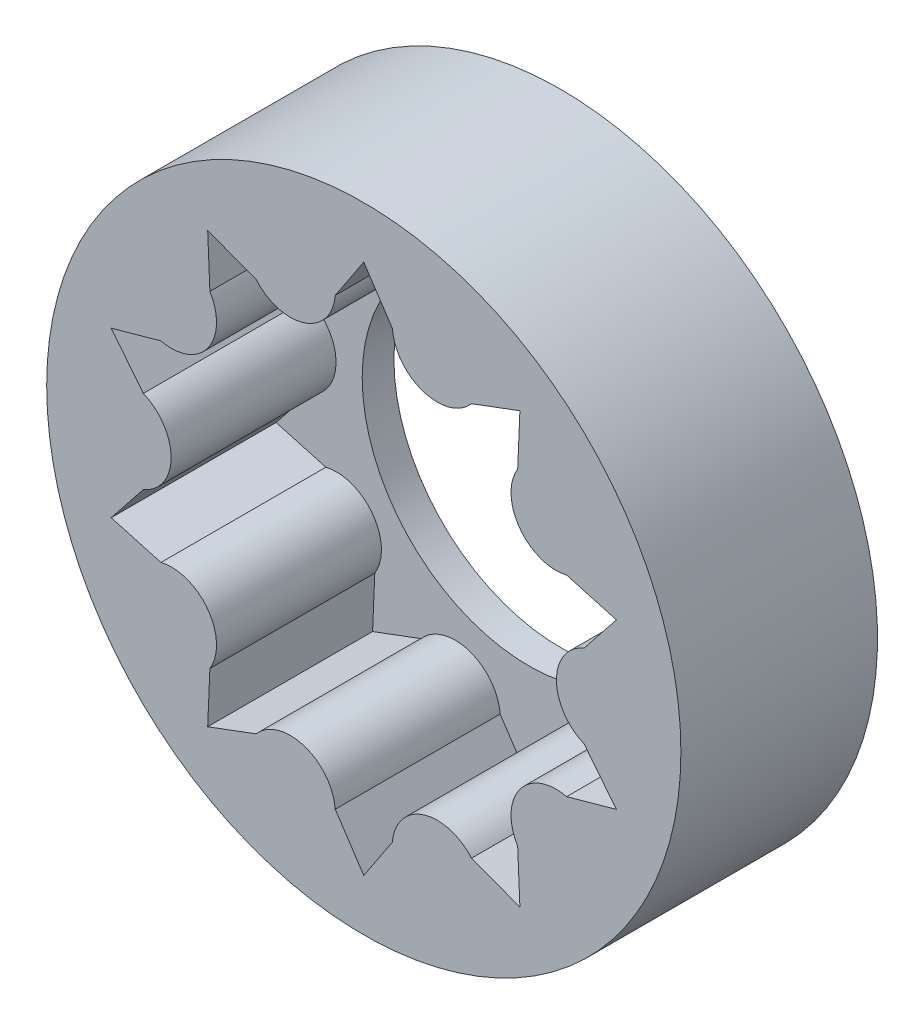
ISO-10303-21;
HEADER;
FILE_DESCRIPTION(('STEP AP214'),'2;1');
FILE_NAME('part.step','',(''),(''),'','','');
FILE_SCHEMA(('AUTOMOTIVE_DESIGN { 1 0 10303 214 1 1 1 1 }'));
ENDSEC;
DATA;
#1=APPLICATION_CONTEXT('core data for automotive mechanical design processes');
#2=APPLICATION_PROTOCOL_DEFINITION('international standard','automotive_design',2000,#1);
#3=PRODUCT_CONTEXT('',#1,'mechanical');
#4=PRODUCT('Part','Part','',(#3));
#5=PRODUCT_RELATED_PRODUCT_CATEGORY('part','',(#4));
#6=PRODUCT_DEFINITION_FORMATION('','',#4);
#7=PRODUCT_DEFINITION_CONTEXT('part definition',#1,'design');
#8=PRODUCT_DEFINITION('design','',#6,#7);
#9=PRODUCT_DEFINITION_SHAPE('','',#8);
#10=(LENGTH_UNIT() NAMED_UNIT(*) SI_UNIT(.MILLI.,.METRE.));
#11=(NAMED_UNIT(*) PLANE_ANGLE_UNIT() SI_UNIT($,.RADIAN.));
#12=(NAMED_UNIT(*) SI_UNIT($,.STERADIAN.) SOLID_ANGLE_UNIT());
#13=UNCERTAINTY_MEASURE_WITH_UNIT(LENGTH_MEASURE(1.E-05),#10,'distance_accuracy_value','');
#14=(GEOMETRIC_REPRESENTATION_CONTEXT(3) GLOBAL_UNCERTAINTY_ASSIGNED_CONTEXT((#13)) GLOBAL_UNIT_ASSIGNED_CONTEXT((#10,
#11,#12)) REPRESENTATION_CONTEXT('',''));
#15=CARTESIAN_POINT('',(0.,0.,0.));
#16=DIRECTION('',(0.,0.,1.));
#17=DIRECTION('',(1.,0.,0.));
#18=AXIS2_PLACEMENT_3D('',#15,#16,#17);
#19=CARTESIAN_POINT('',(7.7145187522875,5.11511880268551,10.4));
#20=DIRECTION('',(0.833438523812044,0.552612185014048,0.));
#21=DIRECTION('',(-0.552612185014048,0.833438523812044,0.));
#22=AXIS2_PLACEMENT_3D('',#19,#20,#21);
#23=PLANE('',#22);
#24=DIRECTION('',(0.552612185014048,-0.833438523812044,0.));
#25=VECTOR('',#24,1.);
#26=CARTESIAN_POINT('',(7.7145187522875,5.11511880268551,0.));
#27=LINE('',#26,#25);
#28=CARTESIAN_POINT('',(0.,16.75,0.));
#29=VERTEX_POINT('',#28);
#30=CARTESIAN_POINT('',(1.80016738124717,14.0350239543612,0.));
#31=VERTEX_POINT('',#30);
#32=EDGE_CURVE('E543',#29,#31,#27,.T.);
#33=ORIENTED_EDGE('',*,*,#32,.T.);
#34=DIRECTION('',(0.,0.,-1.));
#35=VECTOR('',#34,1.);
#36=CARTESIAN_POINT('',(1.80016738124717,14.0350239543612,10.4));
#37=LINE('',#36,#35);
#38=CARTESIAN_POINT('',(1.80016738124717,14.0350239543612,10.4));
#39=VERTEX_POINT('',#38);
#40=EDGE_CURVE('E11',#39,#31,#37,.T.);
#41=ORIENTED_EDGE('',*,*,#40,.F.);
#42=DIRECTION('',(0.552612185014048,-0.833438523812044,0.));
#43=VECTOR('',#42,1.);
#44=CARTESIAN_POINT('',(7.7145187522875,5.11511880268551,10.4));
#45=LINE('',#44,#43);
#46=CARTESIAN_POINT('',(0.,16.75,10.4));
#47=VERTEX_POINT('',#46);
#48=EDGE_CURVE('E544',#47,#39,#45,.T.);
#49=ORIENTED_EDGE('',*,*,#48,.F.);
#50=DIRECTION('',(0.,0.,-1.));
#51=VECTOR('',#50,1.);
#52=CARTESIAN_POINT('',(0.,16.75,10.4));
#53=LINE('',#52,#51);
#54=EDGE_CURVE('E556',#47,#29,#53,.T.);
#55=ORIENTED_EDGE('',*,*,#54,.T.);
#56=EDGE_LOOP('',(#33,#41,#49,#55));
#57=FACE_BOUND('',#56,.T.);
#58=ADVANCED_FACE('F41',(#57),#23,.F.);
#59=CARTESIAN_POINT('',(4.63248079498068,14.2573098789925,10.4));
#60=DIRECTION('',(0.,0.,-1.));
#61=DIRECTION('',(-1.,0.,0.));
#62=AXIS2_PLACEMENT_3D('',#59,#60,#61);
#63=CYLINDRICAL_SURFACE('',#62,2.84102275701973);
#64=CARTESIAN_POINT('',(4.63248079498068,14.2573098789925,0.));
#65=DIRECTION('',(0.,0.,1.));
#66=DIRECTION('',(1.,0.,0.));
#67=AXIS2_PLACEMENT_3D('',#64,#65,#66);
#68=CIRCLE('',#67,2.84102275701973);
#69=CARTESIAN_POINT('',(6.79321409179673,12.4126847338928,0.));
#70=VERTEX_POINT('',#69);
#71=EDGE_CURVE('E560',#31,#70,#68,.T.);
#72=ORIENTED_EDGE('',*,*,#71,.T.);
#73=DIRECTION('',(0.,0.,-1.));
#74=VECTOR('',#73,1.);
#75=CARTESIAN_POINT('',(6.79321409179673,12.4126847338928,10.4));
#76=LINE('',#75,#74);
#77=CARTESIAN_POINT('',(6.79321409179673,12.4126847338928,10.4));
#78=VERTEX_POINT('',#77);
#79=EDGE_CURVE('E49',#78,#70,#76,.T.);
#80=ORIENTED_EDGE('',*,*,#79,.F.);
#81=CARTESIAN_POINT('',(4.63248079498068,14.2573098789925,10.4));
#82=DIRECTION('',(0.,0.,1.));
#83=DIRECTION('',(1.,0.,0.));
#84=AXIS2_PLACEMENT_3D('',#81,#82,#83);
#85=CIRCLE('',#84,2.84102275701973);
#86=EDGE_CURVE('E61',#39,#78,#85,.T.);
#87=ORIENTED_EDGE('',*,*,#86,.F.);
#88=ORIENTED_EDGE('',*,*,#40,.T.);
#89=EDGE_LOOP('',(#72,#80,#87,#88));
#90=FACE_BOUND('',#89,.T.);
#91=ADVANCED_FACE('F578',(#90),#63,.T.);
#92=CARTESIAN_POINT('',(-3.23458537808231,8.67269839074775,10.4));
#93=DIRECTION('',(-0.349448636942334,0.936955521964167,0.));
#94=DIRECTION('',(-0.936955521964167,-0.349448636942334,0.));
#95=AXIS2_PLACEMENT_3D('',#92,#93,#94);
#96=PLANE('',#95);
#97=DIRECTION('',(0.936955521964167,0.349448636942334,0.));
#98=VECTOR('',#97,1.);
#99=CARTESIAN_POINT('',(-3.23458537808231,8.67269839074775,0.));
#100=LINE('',#99,#98);
#101=CARTESIAN_POINT('',(9.84540297589875,13.5510346557805,0.));
#102=VERTEX_POINT('',#101);
#103=EDGE_CURVE('E547',#70,#102,#100,.T.);
#104=ORIENTED_EDGE('',*,*,#103,.T.);
#105=DIRECTION('',(0.,0.,-1.));
#106=VECTOR('',#105,1.);
#107=CARTESIAN_POINT('',(9.84540297589894,13.5510346557804,10.4));
#108=LINE('',#107,#106);
#109=CARTESIAN_POINT('',(9.84540297589894,13.5510346557804,10.4));
#110=VERTEX_POINT('',#109);
#111=EDGE_CURVE('E570',#110,#102,#108,.T.);
#112=ORIENTED_EDGE('',*,*,#111,.F.);
#113=DIRECTION('',(0.936955521964167,0.349448636942334,0.));
#114=VECTOR('',#113,1.);
#115=CARTESIAN_POINT('',(-3.23458537808231,8.67269839074775,10.4));
#116=LINE('',#115,#114);
#117=EDGE_CURVE('E56',#78,#110,#116,.T.);
#118=ORIENTED_EDGE('',*,*,#117,.F.);
#119=ORIENTED_EDGE('',*,*,#79,.T.);
#120=EDGE_LOOP('',(#104,#112,#118,#119));
#121=FACE_BOUND('',#120,.T.);
#122=ADVANCED_FACE('F576',(#121),#96,.F.);
#123=CARTESIAN_POINT('',(0.,0.,10.4));
#124=DIRECTION('',(0.,0.,-1.));
#125=DIRECTION('',(-1.,0.,0.));
#126=AXIS2_PLACEMENT_3D('',#123,#124,#125);
#127=CYLINDRICAL_SURFACE('',#126,20.);
#128=CARTESIAN_POINT('',(0.,0.,10.4));
#129=DIRECTION('',(0.,0.,1.));
#130=DIRECTION('',(1.,0.,0.));
#131=AXIS2_PLACEMENT_3D('',#128,#129,#130);
#132=CIRCLE('',#131,20.);
#133=CARTESIAN_POINT('',(20.,0.,10.4));
#134=VERTEX_POINT('',#133);
#135=EDGE_CURVE('E552',#134,#134,#132,.T.);
#136=ORIENTED_EDGE('',*,*,#135,.F.);
#137=EDGE_LOOP('',(#136));
#138=FACE_BOUND('',#137,.T.);
#139=CARTESIAN_POINT('',(0.,0.,-2.));
#140=DIRECTION('',(0.,0.,-1.));
#141=DIRECTION('',(-1.,0.,0.));
#142=AXIS2_PLACEMENT_3D('',#139,#140,#141);
#143=CIRCLE('',#142,20.);
#144=CARTESIAN_POINT('',(-20.,0.,-2.));
#145=VERTEX_POINT('',#144);
#146=EDGE_CURVE('E582',#145,#145,#143,.T.);
#147=ORIENTED_EDGE('',*,*,#146,.F.);
#148=EDGE_LOOP('',(#147));
#149=FACE_BOUND('',#148,.T.);
#150=ADVANCED_FACE('F682',(#138,#149),#127,.T.);
#151=CARTESIAN_POINT('',(0.,0.,10.4));
#152=DIRECTION('',(0.,0.,1.));
#153=DIRECTION('',(1.,0.,0.));
#154=AXIS2_PLACEMENT_3D('',#151,#152,#153);
#155=PLANE('',#154);
#156=ORIENTED_EDGE('',*,*,#135,.T.);
#157=EDGE_LOOP('',(#156));
#158=FACE_BOUND('',#157,.T.);
#159=ORIENTED_EDGE('',*,*,#48,.T.);
#160=ORIENTED_EDGE('',*,*,#86,.T.);
#161=ORIENTED_EDGE('',*,*,#117,.T.);
#162=DIRECTION('',(-0.0428102240140782,-0.999083222119091,0.));
#163=VECTOR('',#162,1.);
#164=CARTESIAN_POINT('',(9.24776816996728,-0.39626231150879,10.4));
#165=LINE('',#164,#163);
#166=CARTESIAN_POINT('',(9.7059461000934,10.2964610571828,10.4));
#167=VERTEX_POINT('',#166);
#168=EDGE_CURVE('E249',#110,#167,#165,.T.);
#169=ORIENTED_EDGE('',*,*,#168,.T.);
#170=CARTESIAN_POINT('',(12.1279921734904,8.8115020933572,10.4));
#171=DIRECTION('',(0.,0.,1.));
#172=DIRECTION('',(0.809016994374955,-0.587785252292462,0.));
#173=AXIS2_PLACEMENT_3D('',#170,#171,#172);
#174=CIRCLE('',#173,2.84102275701973);
#175=CARTESIAN_POINT('',(12.7918186746289,6.04912183671436,10.4));
#176=VERTEX_POINT('',#175);
#177=EDGE_CURVE('E270',#167,#176,#174,.T.);
#178=ORIENTED_EDGE('',*,*,#177,.T.);
#179=DIRECTION('',(0.963413695470875,-0.268018751917012,0.));
#180=VECTOR('',#179,1.);
#181=CARTESIAN_POINT('',(2.48084967103677,8.91760196772087,10.4));
#182=LINE('',#181,#180);
#183=CARTESIAN_POINT('',(15.9301966479438,5.17603465578055,10.4));
#184=VERTEX_POINT('',#183);
#185=EDGE_CURVE('E264',#176,#184,#182,.T.);
#186=ORIENTED_EDGE('',*,*,#185,.T.);
#187=DIRECTION('',(-0.621880582534836,-0.783112087166411,0.));
#188=VECTOR('',#187,1.);
#189=CARTESIAN_POINT('',(7.24868446679903,-5.75628469116745,10.4));
#190=LINE('',#189,#188);
#191=CARTESIAN_POINT('',(13.9043833016786,2.62500000000015,10.4));
#192=VERTEX_POINT('',#191);
#193=EDGE_CURVE('E273',#184,#192,#190,.T.);
#194=ORIENTED_EDGE('',*,*,#193,.T.);
#195=CARTESIAN_POINT('',(14.9910227570197,1.62196645003831E-13,10.4));
#196=DIRECTION('',(0.,0.,1.));
#197=DIRECTION('',(0.309016994374958,-0.95105651629515,0.));
#198=AXIS2_PLACEMENT_3D('',#195,#196,#197);
#199=CIRCLE('',#198,2.84102275701973);
#200=CARTESIAN_POINT('',(13.9043833016787,-2.62499999999985,10.4));
#201=VERTEX_POINT('',#200);
#202=EDGE_CURVE('E277',#192,#201,#199,.T.);
#203=ORIENTED_EDGE('',*,*,#202,.T.);
#204=DIRECTION('',(0.621880582534852,-0.783112087166399,0.));
#205=VECTOR('',#204,1.);
#206=CARTESIAN_POINT('',(7.24868446679892,5.7562846911676,10.4));
#207=LINE('',#206,#205);
#208=CARTESIAN_POINT('',(15.9301966479439,-5.17603465578022,10.4));
#209=VERTEX_POINT('',#208);
#210=EDGE_CURVE('E281',#201,#209,#207,.T.);
#211=ORIENTED_EDGE('',*,*,#210,.T.);
#212=DIRECTION('',(-0.963413695470869,-0.268018751917032,0.));
#213=VECTOR('',#212,1.);
#214=CARTESIAN_POINT('',(2.48084967103695,-8.91760196772081,10.4));
#215=LINE('',#214,#213);
#216=CARTESIAN_POINT('',(12.7918186746291,-6.04912183671408,10.4));
#217=VERTEX_POINT('',#216);
#218=EDGE_CURVE('E306',#209,#217,#215,.T.);
#219=ORIENTED_EDGE('',*,*,#218,.T.);
#220=CARTESIAN_POINT('',(12.1279921734906,-8.81150209335694,10.4));
#221=DIRECTION('',(0.,0.,1.));
#222=DIRECTION('',(-0.309016994374938,-0.951056516295157,0.));
#223=AXIS2_PLACEMENT_3D('',#220,#221,#222);
#224=CIRCLE('',#223,2.84102275701973);
#225=CARTESIAN_POINT('',(9.70594610009362,-10.2964610571826,10.4));
#226=VERTEX_POINT('',#225);
#227=EDGE_CURVE('E310',#217,#226,#224,.T.);
#228=ORIENTED_EDGE('',*,*,#227,.T.);
#229=DIRECTION('',(0.042810224014099,-0.99908322211909,0.));
#230=VECTOR('',#229,1.);
#231=CARTESIAN_POINT('',(9.24776816996728,0.396262311508983,10.4));
#232=LINE('',#231,#230);
#233=CARTESIAN_POINT('',(9.84540297589904,-13.5510346557803,10.4));
#234=VERTEX_POINT('',#233);
#235=EDGE_CURVE('E314',#226,#234,#232,.T.);
#236=ORIENTED_EDGE('',*,*,#235,.T.);
#237=DIRECTION('',(-0.936955521964169,0.349448636942328,0.));
#238=VECTOR('',#237,1.);
#239=CARTESIAN_POINT('',(-3.23458537808225,-8.67269839074776,10.4));
#240=LINE('',#239,#238);
#241=CARTESIAN_POINT('',(6.79321409179682,-12.4126847338927,10.4));
#242=VERTEX_POINT('',#241);
#243=EDGE_CURVE('E340',#234,#242,#240,.T.);
#244=ORIENTED_EDGE('',*,*,#243,.T.);
#245=CARTESIAN_POINT('',(4.63248079498079,-14.2573098789925,10.4));
#246=DIRECTION('',(0.,0.,1.));
#247=DIRECTION('',(-0.809016994374942,-0.58778525229248,0.));
#248=AXIS2_PLACEMENT_3D('',#245,#246,#247);
#249=CIRCLE('',#248,2.84102275701973);
#250=CARTESIAN_POINT('',(1.80016738124728,-14.0350239543612,10.4));
#251=VERTEX_POINT('',#250);
#252=EDGE_CURVE('E344',#242,#251,#249,.T.);
#253=ORIENTED_EDGE('',*,*,#252,.T.);
#254=DIRECTION('',(-0.552612185014042,-0.833438523812048,0.));
#255=VECTOR('',#254,1.);
#256=CARTESIAN_POINT('',(7.71451875228754,-5.11511880268546,10.4));
#257=LINE('',#256,#255);
#258=CARTESIAN_POINT('',(1.26634813746307E-13,-16.75,10.4));
#259=VERTEX_POINT('',#258);
#260=EDGE_CURVE('E348',#251,#259,#257,.T.);
#261=ORIENTED_EDGE('',*,*,#260,.T.);
#262=DIRECTION('',(-0.552612185014048,0.833438523812044,0.));
#263=VECTOR('',#262,1.);
#264=CARTESIAN_POINT('',(-7.7145187522875,-5.11511880268551,10.4));
#265=LINE('',#264,#263);
#266=CARTESIAN_POINT('',(-1.80016738124717,-14.0350239543612,10.4));
#267=VERTEX_POINT('',#266);
#268=EDGE_CURVE('E374',#259,#267,#265,.T.);
#269=ORIENTED_EDGE('',*,*,#268,.T.);
#270=CARTESIAN_POINT('',(-4.63248079498068,-14.2573098789925,10.4));
#271=DIRECTION('',(0.,0.,1.));
#272=DIRECTION('',(-1.,0.,0.));
#273=AXIS2_PLACEMENT_3D('',#270,#271,#272);
#274=CIRCLE('',#273,2.84102275701973);
#275=CARTESIAN_POINT('',(-6.79321409179673,-12.4126847338928,10.4));
#276=VERTEX_POINT('',#275);
#277=EDGE_CURVE('E378',#267,#276,#274,.T.);
#278=ORIENTED_EDGE('',*,*,#277,.T.);
#279=DIRECTION('',(-0.936955521964167,-0.349448636942334,0.));
#280=VECTOR('',#279,1.);
#281=CARTESIAN_POINT('',(3.23458537808231,-8.67269839074775,10.4));
#282=LINE('',#281,#280);
#283=CARTESIAN_POINT('',(-9.84540297589894,-13.5510346557804,10.4));
#284=VERTEX_POINT('',#283);
#285=EDGE_CURVE('E382',#276,#284,#282,.T.);
#286=ORIENTED_EDGE('',*,*,#285,.T.);
#287=DIRECTION('',(0.0428102240140856,0.999083222119091,0.));
#288=VECTOR('',#287,1.);
#289=CARTESIAN_POINT('',(-9.24776816996728,0.396262311508859,10.4));
#290=LINE('',#289,#288);
#291=CARTESIAN_POINT('',(-9.70594610009348,-10.2964610571827,10.4));
#292=VERTEX_POINT('',#291);
#293=EDGE_CURVE('E408',#284,#292,#290,.T.);
#294=ORIENTED_EDGE('',*,*,#293,.T.);
#295=CARTESIAN_POINT('',(-12.1279921734905,-8.81150209335711,10.4));
#296=DIRECTION('',(0.,0.,1.));
#297=DIRECTION('',(-0.809016994374951,0.587785252292469,0.));
#298=AXIS2_PLACEMENT_3D('',#295,#296,#297);
#299=CIRCLE('',#298,2.84102275701973);
#300=CARTESIAN_POINT('',(-12.791818674629,-6.04912183671426,10.4));
#301=VERTEX_POINT('',#300);
#302=EDGE_CURVE('E412',#292,#301,#299,.T.);
#303=ORIENTED_EDGE('',*,*,#302,.T.);
#304=DIRECTION('',(-0.963413695470873,0.268018751917019,0.));
#305=VECTOR('',#304,1.);
#306=CARTESIAN_POINT('',(-2.48084967103683,-8.91760196772086,10.4));
#307=LINE('',#306,#305);
#308=CARTESIAN_POINT('',(-15.9301966479438,-5.17603465578044,10.4));
#309=VERTEX_POINT('',#308);
#310=EDGE_CURVE('E416',#301,#309,#307,.T.);
#311=ORIENTED_EDGE('',*,*,#310,.T.);
#312=DIRECTION('',(0.621880582534841,0.783112087166407,0.));
#313=VECTOR('',#312,1.);
#314=CARTESIAN_POINT('',(-7.24868446679899,5.7562846911675,10.4));
#315=LINE('',#314,#313);
#316=CARTESIAN_POINT('',(-13.9043833016786,-2.62500000000005,10.4));
#317=VERTEX_POINT('',#316);
#318=EDGE_CURVE('E442',#309,#317,#315,.T.);
#319=ORIENTED_EDGE('',*,*,#318,.T.);
#320=CARTESIAN_POINT('',(-14.9910227570197,0.,10.4));
#321=DIRECTION('',(0.,0.,1.));
#322=DIRECTION('',(-0.309016994374952,0.951056516295152,0.));
#323=AXIS2_PLACEMENT_3D('',#320,#321,#322);
#324=CIRCLE('',#323,2.84102275701973);
#325=CARTESIAN_POINT('',(-13.9043833016787,2.62499999999995,10.4));
#326=VERTEX_POINT('',#325);
#327=EDGE_CURVE('E446',#317,#326,#324,.T.);
#328=ORIENTED_EDGE('',*,*,#327,.T.);
#329=DIRECTION('',(-0.621880582534847,0.783112087166403,0.));
#330=VECTOR('',#329,1.);
#331=CARTESIAN_POINT('',(-7.24868446679896,-5.75628469116755,10.4));
#332=LINE('',#331,#330);
#333=CARTESIAN_POINT('',(-15.9301966479438,5.17603465578032,10.4));
#334=VERTEX_POINT('',#333);
#335=EDGE_CURVE('E450',#326,#334,#332,.T.);
#336=ORIENTED_EDGE('',*,*,#335,.T.);
#337=DIRECTION('',(0.963413695470871,0.268018751917025,0.));
#338=VECTOR('',#337,1.);
#339=CARTESIAN_POINT('',(-2.48084967103689,8.91760196772083,10.4));
#340=LINE('',#339,#338);
#341=CARTESIAN_POINT('',(-12.791818674629,6.04912183671417,10.4));
#342=VERTEX_POINT('',#341);
#343=EDGE_CURVE('E476',#334,#342,#340,.T.);
#344=ORIENTED_EDGE('',*,*,#343,.T.);
#345=CARTESIAN_POINT('',(-12.1279921734906,8.81150209335702,10.4));
#346=DIRECTION('',(0.,0.,1.));
#347=DIRECTION('',(0.309016994374945,0.951056516295155,0.));
#348=AXIS2_PLACEMENT_3D('',#345,#346,#347);
#349=CIRCLE('',#348,2.84102275701973);
#350=CARTESIAN_POINT('',(-9.70594610009355,10.2964610571827,10.4));
#351=VERTEX_POINT('',#350);
#352=EDGE_CURVE('E480',#342,#351,#349,.T.);
#353=ORIENTED_EDGE('',*,*,#352,.T.);
#354=DIRECTION('',(-0.0428102240140923,0.999083222119091,0.));
#355=VECTOR('',#354,1.);
#356=CARTESIAN_POINT('',(-9.24776816996729,-0.396262311508921,10.4));
#357=LINE('',#356,#355);
#358=CARTESIAN_POINT('',(-9.84540297589895,13.5510346557804,10.4));
#359=VERTEX_POINT('',#358);
#360=EDGE_CURVE('E484',#351,#359,#357,.T.);
#361=ORIENTED_EDGE('',*,*,#360,.T.);
#362=DIRECTION('',(0.936955521964167,-0.349448636942335,0.));
#363=VECTOR('',#362,1.);
#364=CARTESIAN_POINT('',(3.23458537808231,8.67269839074774,10.4));
#365=LINE('',#364,#363);
#366=CARTESIAN_POINT('',(-6.79321409179673,12.4126847338928,10.4));
#367=VERTEX_POINT('',#366);
#368=EDGE_CURVE('E510',#359,#367,#365,.T.);
#369=ORIENTED_EDGE('',*,*,#368,.T.);
#370=CARTESIAN_POINT('',(-4.63248079498069,14.2573098789926,10.4));
#371=DIRECTION('',(0.,0.,1.));
#372=DIRECTION('',(0.809016994374947,0.587785252292474,0.));
#373=AXIS2_PLACEMENT_3D('',#370,#371,#372);
#374=CIRCLE('',#373,2.84102275701973);
#375=CARTESIAN_POINT('',(-1.80016738124718,14.0350239543612,10.4));
#376=VERTEX_POINT('',#375);
#377=EDGE_CURVE('E514',#367,#376,#374,.T.);
#378=ORIENTED_EDGE('',*,*,#377,.T.);
#379=DIRECTION('',(0.552612185014049,0.833438523812044,0.));
#380=VECTOR('',#379,1.);
#381=CARTESIAN_POINT('',(-7.7145187522875,5.11511880268552,10.4));
#382=LINE('',#381,#380);
#383=EDGE_CURVE('E518',#376,#47,#382,.T.);
#384=ORIENTED_EDGE('',*,*,#383,.T.);
#385=EDGE_LOOP('',(#159,#160,#161,#169,#178,#186,#194,#203,#211,#219,#228,#236,#244,#253,#261,
#269,#278,#286,#294,#303,#311,#319,#328,#336,#344,#353,#361,#369,#378,#384));
#386=FACE_BOUND('',#385,.T.);
#387=ADVANCED_FACE('F648',(#158,#386),#155,.T.);
#388=CARTESIAN_POINT('',(3.23458537808231,8.67269839074774,10.4));
#389=DIRECTION('',(0.349448636942335,0.936955521964167,0.));
#390=DIRECTION('',(-0.936955521964167,0.349448636942335,0.));
#391=AXIS2_PLACEMENT_3D('',#388,#389,#390);
#392=PLANE('',#391);
#393=DIRECTION('',(0.936955521964167,-0.349448636942335,0.));
#394=VECTOR('',#393,1.);
#395=CARTESIAN_POINT('',(3.23458537808231,8.67269839074774,0.));
#396=LINE('',#395,#394);
#397=CARTESIAN_POINT('',(-9.84540297589894,13.5510346557804,0.));
#398=VERTEX_POINT('',#397);
#399=CARTESIAN_POINT('',(-6.79321409179673,12.4126847338928,0.));
#400=VERTEX_POINT('',#399);
#401=EDGE_CURVE('E509',#398,#400,#396,.T.);
#402=ORIENTED_EDGE('',*,*,#401,.T.);
#403=DIRECTION('',(0.,0.,-1.));
#404=VECTOR('',#403,1.);
#405=CARTESIAN_POINT('',(-6.79321409179673,12.4126847338928,10.4));
#406=LINE('',#405,#404);
#407=EDGE_CURVE('E539',#367,#400,#406,.T.);
#408=ORIENTED_EDGE('',*,*,#407,.F.);
#409=ORIENTED_EDGE('',*,*,#368,.F.);
#410=DIRECTION('',(0.,0.,-1.));
#411=VECTOR('',#410,1.);
#412=CARTESIAN_POINT('',(-9.84540297589895,13.5510346557804,10.4));
#413=LINE('',#412,#411);
#414=EDGE_CURVE('E521',#359,#398,#413,.T.);
#415=ORIENTED_EDGE('',*,*,#414,.T.);
#416=EDGE_LOOP('',(#402,#408,#409,#415));
#417=FACE_BOUND('',#416,.T.);
#418=ADVANCED_FACE('F631',(#417),#392,.F.);
#419=CARTESIAN_POINT('',(-4.63248079498069,14.2573098789926,10.4));
#420=DIRECTION('',(0.,0.,-1.));
#421=DIRECTION('',(-1.,0.,0.));
#422=AXIS2_PLACEMENT_3D('',#419,#420,#421);
#423=CYLINDRICAL_SURFACE('',#422,2.84102275701973);
#424=CARTESIAN_POINT('',(-4.63248079498069,14.2573098789926,0.));
#425=DIRECTION('',(0.,0.,1.));
#426=DIRECTION('',(0.809016994374947,0.587785252292474,0.));
#427=AXIS2_PLACEMENT_3D('',#424,#425,#426);
#428=CIRCLE('',#427,2.84102275701973);
#429=CARTESIAN_POINT('',(-1.80016738124718,14.0350239543612,0.));
#430=VERTEX_POINT('',#429);
#431=EDGE_CURVE('E525',#400,#430,#428,.T.);
#432=ORIENTED_EDGE('',*,*,#431,.T.);
#433=DIRECTION('',(0.,0.,-1.));
#434=VECTOR('',#433,1.);
#435=CARTESIAN_POINT('',(-1.80016738124718,14.0350239543612,10.4));
#436=LINE('',#435,#434);
#437=EDGE_CURVE('E535',#376,#430,#436,.T.);
#438=ORIENTED_EDGE('',*,*,#437,.F.);
#439=ORIENTED_EDGE('',*,*,#377,.F.);
#440=ORIENTED_EDGE('',*,*,#407,.T.);
#441=EDGE_LOOP('',(#432,#438,#439,#440));
#442=FACE_BOUND('',#441,.T.);
#443=ADVANCED_FACE('F627',(#442),#423,.T.);
#444=CARTESIAN_POINT('',(-7.7145187522875,5.11511880268552,10.4));
#445=DIRECTION('',(-0.833438523812044,0.552612185014048,0.));
#446=DIRECTION('',(-0.552612185014049,-0.833438523812044,0.));
#447=AXIS2_PLACEMENT_3D('',#444,#445,#446);
#448=PLANE('',#447);
#449=DIRECTION('',(0.552612185014049,0.833438523812044,0.));
#450=VECTOR('',#449,1.);
#451=CARTESIAN_POINT('',(-7.7145187522875,5.11511880268552,0.));
#452=LINE('',#451,#450);
#453=EDGE_CURVE('E515',#430,#29,#452,.T.);
#454=ORIENTED_EDGE('',*,*,#453,.T.);
#455=ORIENTED_EDGE('',*,*,#54,.F.);
#456=ORIENTED_EDGE('',*,*,#383,.F.);
#457=ORIENTED_EDGE('',*,*,#437,.T.);
#458=EDGE_LOOP('',(#454,#455,#456,#457));
#459=FACE_BOUND('',#458,.T.);
#460=ADVANCED_FACE('F624',(#459),#448,.F.);
#461=CARTESIAN_POINT('',(-2.48084967103689,8.91760196772083,10.4));
#462=DIRECTION('',(-0.268018751917025,0.963413695470871,0.));
#463=DIRECTION('',(-0.963413695470871,-0.268018751917025,0.));
#464=AXIS2_PLACEMENT_3D('',#461,#462,#463);
#465=PLANE('',#464);
#466=DIRECTION('',(0.963413695470871,0.268018751917025,0.));
#467=VECTOR('',#466,1.);
#468=CARTESIAN_POINT('',(-2.48084967103689,8.91760196772083,0.));
#469=LINE('',#468,#467);
#470=CARTESIAN_POINT('',(-15.9301966479438,5.17603465578033,0.));
#471=VERTEX_POINT('',#470);
#472=CARTESIAN_POINT('',(-12.791818674629,6.04912183671417,0.));
#473=VERTEX_POINT('',#472);
#474=EDGE_CURVE('E475',#471,#473,#469,.T.);
#475=ORIENTED_EDGE('',*,*,#474,.T.);
#476=DIRECTION('',(0.,0.,-1.));
#477=VECTOR('',#476,1.);
#478=CARTESIAN_POINT('',(-12.791818674629,6.04912183671417,10.4));
#479=LINE('',#478,#477);
#480=EDGE_CURVE('E505',#342,#473,#479,.T.);
#481=ORIENTED_EDGE('',*,*,#480,.F.);
#482=ORIENTED_EDGE('',*,*,#343,.F.);
#483=DIRECTION('',(0.,0.,-1.));
#484=VECTOR('',#483,1.);
#485=CARTESIAN_POINT('',(-15.9301966479438,5.17603465578033,10.4));
#486=LINE('',#485,#484);
#487=EDGE_CURVE('E487',#334,#471,#486,.T.);
#488=ORIENTED_EDGE('',*,*,#487,.T.);
#489=EDGE_LOOP('',(#475,#481,#482,#488));
#490=FACE_BOUND('',#489,.T.);
#491=ADVANCED_FACE('F647',(#490),#465,.F.);
#492=CARTESIAN_POINT('',(-12.1279921734906,8.81150209335702,10.4));
#493=DIRECTION('',(0.,0.,-1.));
#494=DIRECTION('',(-1.,0.,0.));
#495=AXIS2_PLACEMENT_3D('',#492,#493,#494);
#496=CYLINDRICAL_SURFACE('',#495,2.84102275701973);
#497=CARTESIAN_POINT('',(-12.1279921734906,8.81150209335702,0.));
#498=DIRECTION('',(0.,0.,1.));
#499=DIRECTION('',(0.309016994374945,0.951056516295155,0.));
#500=AXIS2_PLACEMENT_3D('',#497,#498,#499);
#501=CIRCLE('',#500,2.84102275701973);
#502=CARTESIAN_POINT('',(-9.70594610009355,10.2964610571827,0.));
#503=VERTEX_POINT('',#502);
#504=EDGE_CURVE('E491',#473,#503,#501,.T.);
#505=ORIENTED_EDGE('',*,*,#504,.T.);
#506=DIRECTION('',(0.,0.,-1.));
#507=VECTOR('',#506,1.);
#508=CARTESIAN_POINT('',(-9.70594610009355,10.2964610571827,10.4));
#509=LINE('',#508,#507);
#510=EDGE_CURVE('E501',#351,#503,#509,.T.);
#511=ORIENTED_EDGE('',*,*,#510,.F.);
#512=ORIENTED_EDGE('',*,*,#352,.F.);
#513=ORIENTED_EDGE('',*,*,#480,.T.);
#514=EDGE_LOOP('',(#505,#511,#512,#513));
#515=FACE_BOUND('',#514,.T.);
#516=ADVANCED_FACE('F638',(#515),#496,.T.);
#517=CARTESIAN_POINT('',(-9.24776816996729,-0.396262311508921,10.4));
#518=DIRECTION('',(-0.99908322211909,-0.0428102240140923,0.));
#519=DIRECTION('',(0.0428102240140923,-0.99908322211909,0.));
#520=AXIS2_PLACEMENT_3D('',#517,#518,#519);
#521=PLANE('',#520);
#522=DIRECTION('',(-0.0428102240140923,0.999083222119091,0.));
#523=VECTOR('',#522,1.);
#524=CARTESIAN_POINT('',(-9.24776816996729,-0.396262311508921,0.));
#525=LINE('',#524,#523);
#526=EDGE_CURVE('E481',#503,#398,#525,.T.);
#527=ORIENTED_EDGE('',*,*,#526,.T.);
#528=ORIENTED_EDGE('',*,*,#414,.F.);
#529=ORIENTED_EDGE('',*,*,#360,.F.);
#530=ORIENTED_EDGE('',*,*,#510,.T.);
#531=EDGE_LOOP('',(#527,#528,#529,#530));
#532=FACE_BOUND('',#531,.T.);
#533=ADVANCED_FACE('F634',(#532),#521,.F.);
#534=CARTESIAN_POINT('',(-7.24868446679899,5.7562846911675,10.4));
#535=DIRECTION('',(-0.783112087166407,0.621880582534841,0.));
#536=DIRECTION('',(-0.621880582534841,-0.783112087166407,0.));
#537=AXIS2_PLACEMENT_3D('',#534,#535,#536);
#538=PLANE('',#537);
#539=DIRECTION('',(0.621880582534841,0.783112087166407,0.));
#540=VECTOR('',#539,1.);
#541=CARTESIAN_POINT('',(-7.24868446679899,5.7562846911675,0.));
#542=LINE('',#541,#540);
#543=CARTESIAN_POINT('',(-15.9301966479438,-5.17603465578044,0.));
#544=VERTEX_POINT('',#543);
#545=CARTESIAN_POINT('',(-13.9043833016786,-2.62500000000005,0.));
#546=VERTEX_POINT('',#545);
#547=EDGE_CURVE('E441',#544,#546,#542,.T.);
#548=ORIENTED_EDGE('',*,*,#547,.T.);
#549=DIRECTION('',(0.,0.,-1.));
#550=VECTOR('',#549,1.);
#551=CARTESIAN_POINT('',(-13.9043833016786,-2.62500000000005,10.4));
#552=LINE('',#551,#550);
#553=EDGE_CURVE('E471',#317,#546,#552,.T.);
#554=ORIENTED_EDGE('',*,*,#553,.F.);
#555=ORIENTED_EDGE('',*,*,#318,.F.);
#556=DIRECTION('',(0.,0.,-1.));
#557=VECTOR('',#556,1.);
#558=CARTESIAN_POINT('',(-15.9301966479438,-5.17603465578044,10.4));
#559=LINE('',#558,#557);
#560=EDGE_CURVE('E453',#309,#544,#559,.T.);
#561=ORIENTED_EDGE('',*,*,#560,.T.);
#562=EDGE_LOOP('',(#548,#554,#555,#561));
#563=FACE_BOUND('',#562,.T.);
#564=ADVANCED_FACE('F659',(#563),#538,.F.);
#565=CARTESIAN_POINT('',(-14.9910227570197,0.,10.4));
#566=DIRECTION('',(0.,0.,-1.));
#567=DIRECTION('',(-1.,0.,0.));
#568=AXIS2_PLACEMENT_3D('',#565,#566,#567);
#569=CYLINDRICAL_SURFACE('',#568,2.84102275701973);
#570=CARTESIAN_POINT('',(-14.9910227570197,0.,0.));
#571=DIRECTION('',(0.,0.,1.));
#572=DIRECTION('',(-0.309016994374952,0.951056516295152,0.));
#573=AXIS2_PLACEMENT_3D('',#570,#571,#572);
#574=CIRCLE('',#573,2.84102275701973);
#575=CARTESIAN_POINT('',(-13.9043833016787,2.62499999999995,0.));
#576=VERTEX_POINT('',#575);
#577=EDGE_CURVE('E457',#546,#576,#574,.T.);
#578=ORIENTED_EDGE('',*,*,#577,.T.);
#579=DIRECTION('',(0.,0.,-1.));
#580=VECTOR('',#579,1.);
#581=CARTESIAN_POINT('',(-13.9043833016787,2.62499999999995,10.4));
#582=LINE('',#581,#580);
#583=EDGE_CURVE('E467',#326,#576,#582,.T.);
#584=ORIENTED_EDGE('',*,*,#583,.F.);
#585=ORIENTED_EDGE('',*,*,#327,.F.);
#586=ORIENTED_EDGE('',*,*,#553,.T.);
#587=EDGE_LOOP('',(#578,#584,#585,#586));
#588=FACE_BOUND('',#587,.T.);
#589=ADVANCED_FACE('F652',(#588),#569,.T.);
#590=CARTESIAN_POINT('',(-7.24868446679896,-5.75628469116755,10.4));
#591=DIRECTION('',(-0.783112087166403,-0.621880582534847,0.));
#592=DIRECTION('',(0.621880582534847,-0.783112087166403,0.));
#593=AXIS2_PLACEMENT_3D('',#590,#591,#592);
#594=PLANE('',#593);
#595=DIRECTION('',(-0.621880582534847,0.783112087166403,0.));
#596=VECTOR('',#595,1.);
#597=CARTESIAN_POINT('',(-7.24868446679896,-5.75628469116755,0.));
#598=LINE('',#597,#596);
#599=EDGE_CURVE('E447',#576,#471,#598,.T.);
#600=ORIENTED_EDGE('',*,*,#599,.T.);
#601=ORIENTED_EDGE('',*,*,#487,.F.);
#602=ORIENTED_EDGE('',*,*,#335,.F.);
#603=ORIENTED_EDGE('',*,*,#583,.T.);
#604=EDGE_LOOP('',(#600,#601,#602,#603));
#605=FACE_BOUND('',#604,.T.);
#606=ADVANCED_FACE('F643',(#605),#594,.F.);
#607=CARTESIAN_POINT('',(-9.24776816996728,0.396262311508859,10.4));
#608=DIRECTION('',(-0.999083222119091,0.0428102240140856,0.));
#609=DIRECTION('',(-0.0428102240140856,-0.999083222119091,0.));
#610=AXIS2_PLACEMENT_3D('',#607,#608,#609);
#611=PLANE('',#610);
#612=DIRECTION('',(0.0428102240140856,0.999083222119091,0.));
#613=VECTOR('',#612,1.);
#614=CARTESIAN_POINT('',(-9.24776816996728,0.396262311508859,0.));
#615=LINE('',#614,#613);
#616=CARTESIAN_POINT('',(-9.84540297589885,-13.5510346557804,0.));
#617=VERTEX_POINT('',#616);
#618=CARTESIAN_POINT('',(-9.70594610009347,-10.2964610571827,0.));
#619=VERTEX_POINT('',#618);
#620=EDGE_CURVE('E407',#617,#619,#615,.T.);
#621=ORIENTED_EDGE('',*,*,#620,.T.);
#622=DIRECTION('',(0.,0.,-1.));
#623=VECTOR('',#622,1.);
#624=CARTESIAN_POINT('',(-9.70594610009348,-10.2964610571827,10.4));
#625=LINE('',#624,#623);
#626=EDGE_CURVE('E437',#292,#619,#625,.T.);
#627=ORIENTED_EDGE('',*,*,#626,.F.);
#628=ORIENTED_EDGE('',*,*,#293,.F.);
#629=DIRECTION('',(0.,0.,-1.));
#630=VECTOR('',#629,1.);
#631=CARTESIAN_POINT('',(-9.84540297589885,-13.5510346557804,10.4));
#632=LINE('',#631,#630);
#633=EDGE_CURVE('E419',#284,#617,#632,.T.);
#634=ORIENTED_EDGE('',*,*,#633,.T.);
#635=EDGE_LOOP('',(#621,#627,#628,#634));
#636=FACE_BOUND('',#635,.T.);
#637=ADVANCED_FACE('F743',(#636),#611,.F.);
#638=CARTESIAN_POINT('',(-12.1279921734905,-8.81150209335711,10.4));
#639=DIRECTION('',(0.,0.,-1.));
#640=DIRECTION('',(-1.,0.,0.));
#641=AXIS2_PLACEMENT_3D('',#638,#639,#640);
#642=CYLINDRICAL_SURFACE('',#641,2.84102275701973);
#643=CARTESIAN_POINT('',(-12.1279921734905,-8.81150209335711,0.));
#644=DIRECTION('',(0.,0.,1.));
#645=DIRECTION('',(-0.809016994374951,0.587785252292469,0.));
#646=AXIS2_PLACEMENT_3D('',#643,#644,#645);
#647=CIRCLE('',#646,2.84102275701973);
#648=CARTESIAN_POINT('',(-12.791818674629,-6.04912183671426,0.));
#649=VERTEX_POINT('',#648);
#650=EDGE_CURVE('E423',#619,#649,#647,.T.);
#651=ORIENTED_EDGE('',*,*,#650,.T.);
#652=DIRECTION('',(0.,0.,-1.));
#653=VECTOR('',#652,1.);
#654=CARTESIAN_POINT('',(-12.791818674629,-6.04912183671426,10.4));
#655=LINE('',#654,#653);
#656=EDGE_CURVE('E433',#301,#649,#655,.T.);
#657=ORIENTED_EDGE('',*,*,#656,.F.);
#658=ORIENTED_EDGE('',*,*,#302,.F.);
#659=ORIENTED_EDGE('',*,*,#626,.T.);
#660=EDGE_LOOP('',(#651,#657,#658,#659));
#661=FACE_BOUND('',#660,.T.);
#662=ADVANCED_FACE('F751',(#661),#642,.T.);
#663=CARTESIAN_POINT('',(-2.48084967103683,-8.91760196772086,10.4));
#664=DIRECTION('',(-0.268018751917019,-0.963413695470873,0.));
#665=DIRECTION('',(0.963413695470873,-0.268018751917019,0.));
#666=AXIS2_PLACEMENT_3D('',#663,#664,#665);
#667=PLANE('',#666);
#668=DIRECTION('',(-0.963413695470873,0.268018751917019,0.));
#669=VECTOR('',#668,1.);
#670=CARTESIAN_POINT('',(-2.48084967103683,-8.91760196772086,0.));
#671=LINE('',#670,#669);
#672=EDGE_CURVE('E413',#649,#544,#671,.T.);
#673=ORIENTED_EDGE('',*,*,#672,.T.);
#674=ORIENTED_EDGE('',*,*,#560,.F.);
#675=ORIENTED_EDGE('',*,*,#310,.F.);
#676=ORIENTED_EDGE('',*,*,#656,.T.);
#677=EDGE_LOOP('',(#673,#674,#675,#676));
#678=FACE_BOUND('',#677,.T.);
#679=ADVANCED_FACE('F656',(#678),#667,.F.);
#680=CARTESIAN_POINT('',(-7.7145187522875,-5.11511880268551,10.4));
#681=DIRECTION('',(-0.833438523812044,-0.552612185014048,0.));
#682=DIRECTION('',(0.552612185014048,-0.833438523812044,0.));
#683=AXIS2_PLACEMENT_3D('',#680,#681,#682);
#684=PLANE('',#683);
#685=DIRECTION('',(-0.552612185014048,0.833438523812044,0.));
#686=VECTOR('',#685,1.);
#687=CARTESIAN_POINT('',(-7.7145187522875,-5.11511880268551,0.));
#688=LINE('',#687,#686);
#689=CARTESIAN_POINT('',(0.,-16.75,0.));
#690=VERTEX_POINT('',#689);
#691=CARTESIAN_POINT('',(-1.80016738124717,-14.0350239543612,0.));
#692=VERTEX_POINT('',#691);
#693=EDGE_CURVE('E373',#690,#692,#688,.T.);
#694=ORIENTED_EDGE('',*,*,#693,.T.);
#695=DIRECTION('',(0.,0.,-1.));
#696=VECTOR('',#695,1.);
#697=CARTESIAN_POINT('',(-1.80016738124717,-14.0350239543612,10.4));
#698=LINE('',#697,#696);
#699=EDGE_CURVE('E403',#267,#692,#698,.T.);
#700=ORIENTED_EDGE('',*,*,#699,.F.);
#701=ORIENTED_EDGE('',*,*,#268,.F.);
#702=DIRECTION('',(0.,0.,-1.));
#703=VECTOR('',#702,1.);
#704=CARTESIAN_POINT('',(0.,-16.75,10.4));
#705=LINE('',#704,#703);
#706=EDGE_CURVE('E385',#259,#690,#705,.T.);
#707=ORIENTED_EDGE('',*,*,#706,.T.);
#708=EDGE_LOOP('',(#694,#700,#701,#707));
#709=FACE_BOUND('',#708,.T.);
#710=ADVANCED_FACE('F770',(#709),#684,.F.);
#711=CARTESIAN_POINT('',(-4.63248079498068,-14.2573098789925,10.4));
#712=DIRECTION('',(0.,0.,-1.));
#713=DIRECTION('',(-1.,0.,0.));
#714=AXIS2_PLACEMENT_3D('',#711,#712,#713);
#715=CYLINDRICAL_SURFACE('',#714,2.84102275701973);
#716=CARTESIAN_POINT('',(-4.63248079498068,-14.2573098789925,0.));
#717=DIRECTION('',(0.,0.,1.));
#718=DIRECTION('',(-1.,0.,0.));
#719=AXIS2_PLACEMENT_3D('',#716,#717,#718);
#720=CIRCLE('',#719,2.84102275701973);
#721=CARTESIAN_POINT('',(-6.79321409179673,-12.4126847338928,0.));
#722=VERTEX_POINT('',#721);
#723=EDGE_CURVE('E389',#692,#722,#720,.T.);
#724=ORIENTED_EDGE('',*,*,#723,.T.);
#725=DIRECTION('',(0.,0.,-1.));
#726=VECTOR('',#725,1.);
#727=CARTESIAN_POINT('',(-6.79321409179673,-12.4126847338928,10.4));
#728=LINE('',#727,#726);
#729=EDGE_CURVE('E399',#276,#722,#728,.T.);
#730=ORIENTED_EDGE('',*,*,#729,.F.);
#731=ORIENTED_EDGE('',*,*,#277,.F.);
#732=ORIENTED_EDGE('',*,*,#699,.T.);
#733=EDGE_LOOP('',(#724,#730,#731,#732));
#734=FACE_BOUND('',#733,.T.);
#735=ADVANCED_FACE('F779',(#734),#715,.T.);
#736=CARTESIAN_POINT('',(3.23458537808231,-8.67269839074775,10.4));
#737=DIRECTION('',(0.349448636942334,-0.936955521964167,0.));
#738=DIRECTION('',(0.936955521964167,0.349448636942334,0.));
#739=AXIS2_PLACEMENT_3D('',#736,#737,#738);
#740=PLANE('',#739);
#741=DIRECTION('',(-0.936955521964167,-0.349448636942334,0.));
#742=VECTOR('',#741,1.);
#743=CARTESIAN_POINT('',(3.23458537808231,-8.67269839074775,0.));
#744=LINE('',#743,#742);
#745=EDGE_CURVE('E379',#722,#617,#744,.T.);
#746=ORIENTED_EDGE('',*,*,#745,.T.);
#747=ORIENTED_EDGE('',*,*,#633,.F.);
#748=ORIENTED_EDGE('',*,*,#285,.F.);
#749=ORIENTED_EDGE('',*,*,#729,.T.);
#750=EDGE_LOOP('',(#746,#747,#748,#749));
#751=FACE_BOUND('',#750,.T.);
#752=ADVANCED_FACE('F789',(#751),#740,.F.);
#753=CARTESIAN_POINT('',(-3.23458537808225,-8.67269839074776,10.4));
#754=DIRECTION('',(-0.349448636942328,-0.93695552196417,0.));
#755=DIRECTION('',(0.93695552196417,-0.349448636942328,0.));
#756=AXIS2_PLACEMENT_3D('',#753,#754,#755);
#757=PLANE('',#756);
#758=DIRECTION('',(-0.936955521964169,0.349448636942328,0.));
#759=VECTOR('',#758,1.);
#760=CARTESIAN_POINT('',(-3.23458537808225,-8.67269839074776,0.));
#761=LINE('',#760,#759);
#762=CARTESIAN_POINT('',(9.84540297589904,-13.5510346557803,0.));
#763=VERTEX_POINT('',#762);
#764=CARTESIAN_POINT('',(6.79321409179682,-12.4126847338927,0.));
#765=VERTEX_POINT('',#764);
#766=EDGE_CURVE('E339',#763,#765,#761,.T.);
#767=ORIENTED_EDGE('',*,*,#766,.T.);
#768=DIRECTION('',(0.,0.,-1.));
#769=VECTOR('',#768,1.);
#770=CARTESIAN_POINT('',(6.79321409179682,-12.4126847338927,10.4));
#771=LINE('',#770,#769);
#772=EDGE_CURVE('E369',#242,#765,#771,.T.);
#773=ORIENTED_EDGE('',*,*,#772,.F.);
#774=ORIENTED_EDGE('',*,*,#243,.F.);
#775=DIRECTION('',(0.,0.,-1.));
#776=VECTOR('',#775,1.);
#777=CARTESIAN_POINT('',(9.84540297589905,-13.5510346557803,10.4));
#778=LINE('',#777,#776);
#779=EDGE_CURVE('E351',#234,#763,#778,.T.);
#780=ORIENTED_EDGE('',*,*,#779,.T.);
#781=EDGE_LOOP('',(#767,#773,#774,#780));
#782=FACE_BOUND('',#781,.T.);
#783=ADVANCED_FACE('F799',(#782),#757,.F.);
#784=CARTESIAN_POINT('',(4.63248079498079,-14.2573098789925,10.4));
#785=DIRECTION('',(0.,0.,-1.));
#786=DIRECTION('',(-1.,0.,0.));
#787=AXIS2_PLACEMENT_3D('',#784,#785,#786);
#788=CYLINDRICAL_SURFACE('',#787,2.84102275701973);
#789=CARTESIAN_POINT('',(4.63248079498079,-14.2573098789925,0.));
#790=DIRECTION('',(0.,0.,1.));
#791=DIRECTION('',(-0.809016994374942,-0.58778525229248,0.));
#792=AXIS2_PLACEMENT_3D('',#789,#790,#791);
#793=CIRCLE('',#792,2.84102275701973);
#794=CARTESIAN_POINT('',(1.80016738124728,-14.0350239543612,0.));
#795=VERTEX_POINT('',#794);
#796=EDGE_CURVE('E355',#765,#795,#793,.T.);
#797=ORIENTED_EDGE('',*,*,#796,.T.);
#798=DIRECTION('',(0.,0.,-1.));
#799=VECTOR('',#798,1.);
#800=CARTESIAN_POINT('',(1.80016738124728,-14.0350239543612,10.4));
#801=LINE('',#800,#799);
#802=EDGE_CURVE('E365',#251,#795,#801,.T.);
#803=ORIENTED_EDGE('',*,*,#802,.F.);
#804=ORIENTED_EDGE('',*,*,#252,.F.);
#805=ORIENTED_EDGE('',*,*,#772,.T.);
#806=EDGE_LOOP('',(#797,#803,#804,#805));
#807=FACE_BOUND('',#806,.T.);
#808=ADVANCED_FACE('F809',(#807),#788,.T.);
#809=CARTESIAN_POINT('',(7.71451875228754,-5.11511880268546,10.4));
#810=DIRECTION('',(0.833438523812048,-0.552612185014042,0.));
#811=DIRECTION('',(0.552612185014042,0.833438523812048,0.));
#812=AXIS2_PLACEMENT_3D('',#809,#810,#811);
#813=PLANE('',#812);
#814=DIRECTION('',(-0.552612185014042,-0.833438523812048,0.));
#815=VECTOR('',#814,1.);
#816=CARTESIAN_POINT('',(7.71451875228754,-5.11511880268546,0.));
#817=LINE('',#816,#815);
#818=EDGE_CURVE('E345',#795,#690,#817,.T.);
#819=ORIENTED_EDGE('',*,*,#818,.T.);
#820=ORIENTED_EDGE('',*,*,#706,.F.);
#821=ORIENTED_EDGE('',*,*,#260,.F.);
#822=ORIENTED_EDGE('',*,*,#802,.T.);
#823=EDGE_LOOP('',(#819,#820,#821,#822));
#824=FACE_BOUND('',#823,.T.);
#825=ADVANCED_FACE('F819',(#824),#813,.F.);
#826=CARTESIAN_POINT('',(2.48084967103695,-8.91760196772081,10.4));
#827=DIRECTION('',(0.268018751917032,-0.963413695470869,0.));
#828=DIRECTION('',(0.963413695470869,0.268018751917032,0.));
#829=AXIS2_PLACEMENT_3D('',#826,#827,#828);
#830=PLANE('',#829);
#831=DIRECTION('',(-0.963413695470869,-0.268018751917032,0.));
#832=VECTOR('',#831,1.);
#833=CARTESIAN_POINT('',(2.48084967103695,-8.91760196772081,0.));
#834=LINE('',#833,#832);
#835=CARTESIAN_POINT('',(15.9301966479439,-5.17603465578021,0.));
#836=VERTEX_POINT('',#835);
#837=CARTESIAN_POINT('',(12.7918186746291,-6.04912183671408,0.));
#838=VERTEX_POINT('',#837);
#839=EDGE_CURVE('E305',#836,#838,#834,.T.);
#840=ORIENTED_EDGE('',*,*,#839,.T.);
#841=DIRECTION('',(0.,0.,-1.));
#842=VECTOR('',#841,1.);
#843=CARTESIAN_POINT('',(12.7918186746291,-6.04912183671408,10.4));
#844=LINE('',#843,#842);
#845=EDGE_CURVE('E335',#217,#838,#844,.T.);
#846=ORIENTED_EDGE('',*,*,#845,.F.);
#847=ORIENTED_EDGE('',*,*,#218,.F.);
#848=DIRECTION('',(0.,0.,-1.));
#849=VECTOR('',#848,1.);
#850=CARTESIAN_POINT('',(15.9301966479439,-5.17603465578022,10.4));
#851=LINE('',#850,#849);
#852=EDGE_CURVE('E317',#209,#836,#851,.T.);
#853=ORIENTED_EDGE('',*,*,#852,.T.);
#854=EDGE_LOOP('',(#840,#846,#847,#853));
#855=FACE_BOUND('',#854,.T.);
#856=ADVANCED_FACE('F829',(#855),#830,.F.);
#857=CARTESIAN_POINT('',(12.1279921734906,-8.81150209335694,10.4));
#858=DIRECTION('',(0.,0.,-1.));
#859=DIRECTION('',(-1.,0.,0.));
#860=AXIS2_PLACEMENT_3D('',#857,#858,#859);
#861=CYLINDRICAL_SURFACE('',#860,2.84102275701973);
#862=CARTESIAN_POINT('',(12.1279921734906,-8.81150209335694,0.));
#863=DIRECTION('',(0.,0.,1.));
#864=DIRECTION('',(-0.309016994374938,-0.951056516295157,0.));
#865=AXIS2_PLACEMENT_3D('',#862,#863,#864);
#866=CIRCLE('',#865,2.84102275701973);
#867=CARTESIAN_POINT('',(9.70594610009362,-10.2964610571826,0.));
#868=VERTEX_POINT('',#867);
#869=EDGE_CURVE('E321',#838,#868,#866,.T.);
#870=ORIENTED_EDGE('',*,*,#869,.T.);
#871=DIRECTION('',(0.,0.,-1.));
#872=VECTOR('',#871,1.);
#873=CARTESIAN_POINT('',(9.70594610009362,-10.2964610571826,10.4));
#874=LINE('',#873,#872);
#875=EDGE_CURVE('E331',#226,#868,#874,.T.);
#876=ORIENTED_EDGE('',*,*,#875,.F.);
#877=ORIENTED_EDGE('',*,*,#227,.F.);
#878=ORIENTED_EDGE('',*,*,#845,.T.);
#879=EDGE_LOOP('',(#870,#876,#877,#878));
#880=FACE_BOUND('',#879,.T.);
#881=ADVANCED_FACE('F839',(#880),#861,.T.);
#882=CARTESIAN_POINT('',(9.24776816996728,0.396262311508983,10.4));
#883=DIRECTION('',(0.99908322211909,0.042810224014099,0.));
#884=DIRECTION('',(-0.042810224014099,0.99908322211909,0.));
#885=AXIS2_PLACEMENT_3D('',#882,#883,#884);
#886=PLANE('',#885);
#887=DIRECTION('',(0.042810224014099,-0.99908322211909,0.));
#888=VECTOR('',#887,1.);
#889=CARTESIAN_POINT('',(9.24776816996728,0.396262311508983,0.));
#890=LINE('',#889,#888);
#891=EDGE_CURVE('E311',#868,#763,#890,.T.);
#892=ORIENTED_EDGE('',*,*,#891,.T.);
#893=ORIENTED_EDGE('',*,*,#779,.F.);
#894=ORIENTED_EDGE('',*,*,#235,.F.);
#895=ORIENTED_EDGE('',*,*,#875,.T.);
#896=EDGE_LOOP('',(#892,#893,#894,#895));
#897=FACE_BOUND('',#896,.T.);
#898=ADVANCED_FACE('F849',(#897),#886,.F.);
#899=CARTESIAN_POINT('',(7.24868446679903,-5.75628469116745,10.4));
#900=DIRECTION('',(0.783112087166411,-0.621880582534836,0.));
#901=DIRECTION('',(0.621880582534836,0.783112087166411,0.));
#902=AXIS2_PLACEMENT_3D('',#899,#900,#901);
#903=PLANE('',#902);
#904=DIRECTION('',(-0.621880582534836,-0.783112087166411,0.));
#905=VECTOR('',#904,1.);
#906=CARTESIAN_POINT('',(7.24868446679903,-5.75628469116745,0.));
#907=LINE('',#906,#905);
#908=CARTESIAN_POINT('',(15.9301966479438,5.17603465578055,0.));
#909=VERTEX_POINT('',#908);
#910=CARTESIAN_POINT('',(13.9043833016786,2.62500000000015,0.));
#911=VERTEX_POINT('',#910);
#912=EDGE_CURVE('E243',#909,#911,#907,.T.);
#913=ORIENTED_EDGE('',*,*,#912,.T.);
#914=DIRECTION('',(0.,0.,-1.));
#915=VECTOR('',#914,1.);
#916=CARTESIAN_POINT('',(13.9043833016786,2.62500000000015,10.4));
#917=LINE('',#916,#915);
#918=EDGE_CURVE('E301',#192,#911,#917,.T.);
#919=ORIENTED_EDGE('',*,*,#918,.F.);
#920=ORIENTED_EDGE('',*,*,#193,.F.);
#921=DIRECTION('',(0.,0.,-1.));
#922=VECTOR('',#921,1.);
#923=CARTESIAN_POINT('',(15.9301966479438,5.17603465578055,10.4));
#924=LINE('',#923,#922);
#925=EDGE_CURVE('E285',#184,#909,#924,.T.);
#926=ORIENTED_EDGE('',*,*,#925,.T.);
#927=EDGE_LOOP('',(#913,#919,#920,#926));
#928=FACE_BOUND('',#927,.T.);
#929=ADVANCED_FACE('F859',(#928),#903,.F.);
#930=CARTESIAN_POINT('',(14.9910227570197,1.62196645003831E-13,10.4));
#931=DIRECTION('',(0.,0.,-1.));
#932=DIRECTION('',(-1.,0.,0.));
#933=AXIS2_PLACEMENT_3D('',#930,#931,#932);
#934=CYLINDRICAL_SURFACE('',#933,2.84102275701973);
#935=CARTESIAN_POINT('',(14.9910227570197,1.62196645003831E-13,0.));
#936=DIRECTION('',(0.,0.,1.));
#937=DIRECTION('',(0.309016994374958,-0.95105651629515,0.));
#938=AXIS2_PLACEMENT_3D('',#935,#936,#937);
#939=CIRCLE('',#938,2.84102275701973);
#940=CARTESIAN_POINT('',(13.9043833016787,-2.62499999999985,0.));
#941=VERTEX_POINT('',#940);
#942=EDGE_CURVE('E288',#911,#941,#939,.T.);
#943=ORIENTED_EDGE('',*,*,#942,.T.);
#944=DIRECTION('',(0.,0.,-1.));
#945=VECTOR('',#944,1.);
#946=CARTESIAN_POINT('',(13.9043833016787,-2.62499999999985,10.4));
#947=LINE('',#946,#945);
#948=EDGE_CURVE('E297',#201,#941,#947,.T.);
#949=ORIENTED_EDGE('',*,*,#948,.F.);
#950=ORIENTED_EDGE('',*,*,#202,.F.);
#951=ORIENTED_EDGE('',*,*,#918,.T.);
#952=EDGE_LOOP('',(#943,#949,#950,#951));
#953=FACE_BOUND('',#952,.T.);
#954=ADVANCED_FACE('F869',(#953),#934,.T.);
#955=CARTESIAN_POINT('',(7.24868446679892,5.7562846911676,10.4));
#956=DIRECTION('',(0.783112087166399,0.621880582534852,0.));
#957=DIRECTION('',(-0.621880582534852,0.783112087166399,0.));
#958=AXIS2_PLACEMENT_3D('',#955,#956,#957);
#959=PLANE('',#958);
#960=DIRECTION('',(0.621880582534852,-0.783112087166399,0.));
#961=VECTOR('',#960,1.);
#962=CARTESIAN_POINT('',(7.24868446679892,5.7562846911676,0.));
#963=LINE('',#962,#961);
#964=EDGE_CURVE('E278',#941,#836,#963,.T.);
#965=ORIENTED_EDGE('',*,*,#964,.T.);
#966=ORIENTED_EDGE('',*,*,#852,.F.);
#967=ORIENTED_EDGE('',*,*,#210,.F.);
#968=ORIENTED_EDGE('',*,*,#948,.T.);
#969=EDGE_LOOP('',(#965,#966,#967,#968));
#970=FACE_BOUND('',#969,.T.);
#971=ADVANCED_FACE('F879',(#970),#959,.F.);
#972=CARTESIAN_POINT('',(9.24776816996728,-0.39626231150879,10.4));
#973=DIRECTION('',(0.999083222119091,-0.0428102240140782,0.));
#974=DIRECTION('',(0.0428102240140782,0.999083222119091,0.));
#975=AXIS2_PLACEMENT_3D('',#972,#973,#974);
#976=PLANE('',#975);
#977=DIRECTION('',(-0.0428102240140782,-0.999083222119091,0.));
#978=VECTOR('',#977,1.);
#979=CARTESIAN_POINT('',(9.24776816996728,-0.39626231150879,0.));
#980=LINE('',#979,#978);
#981=CARTESIAN_POINT('',(9.7059461000934,10.2964610571828,0.));
#982=VERTEX_POINT('',#981);
#983=EDGE_CURVE('E260',#102,#982,#980,.T.);
#984=ORIENTED_EDGE('',*,*,#983,.T.);
#985=DIRECTION('',(0.,0.,-1.));
#986=VECTOR('',#985,1.);
#987=CARTESIAN_POINT('',(9.7059461000934,10.2964610571828,10.4));
#988=LINE('',#987,#986);
#989=EDGE_CURVE('E257',#167,#982,#988,.T.);
#990=ORIENTED_EDGE('',*,*,#989,.F.);
#991=ORIENTED_EDGE('',*,*,#168,.F.);
#992=ORIENTED_EDGE('',*,*,#111,.T.);
#993=EDGE_LOOP('',(#984,#990,#991,#992));
#994=FACE_BOUND('',#993,.T.);
#995=ADVANCED_FACE('F889',(#994),#976,.F.);
#996=CARTESIAN_POINT('',(12.1279921734904,8.8115020933572,10.4));
#997=DIRECTION('',(0.,0.,-1.));
#998=DIRECTION('',(-1.,0.,0.));
#999=AXIS2_PLACEMENT_3D('',#996,#997,#998);
#1000=CYLINDRICAL_SURFACE('',#999,2.84102275701973);
#1001=CARTESIAN_POINT('',(12.1279921734904,8.8115020933572,0.));
#1002=DIRECTION('',(0.,0.,1.));
#1003=DIRECTION('',(0.809016994374955,-0.587785252292462,0.));
#1004=AXIS2_PLACEMENT_3D('',#1001,#1002,#1003);
#1005=CIRCLE('',#1004,2.84102275701973);
#1006=CARTESIAN_POINT('',(12.7918186746289,6.04912183671436,0.));
#1007=VERTEX_POINT('',#1006);
#1008=EDGE_CURVE('E240',#982,#1007,#1005,.T.);
#1009=ORIENTED_EDGE('',*,*,#1008,.T.);
#1010=DIRECTION('',(0.,0.,-1.));
#1011=VECTOR('',#1010,1.);
#1012=CARTESIAN_POINT('',(12.7918186746289,6.04912183671436,10.4));
#1013=LINE('',#1012,#1011);
#1014=EDGE_CURVE('E254',#176,#1007,#1013,.T.);
#1015=ORIENTED_EDGE('',*,*,#1014,.F.);
#1016=ORIENTED_EDGE('',*,*,#177,.F.);
#1017=ORIENTED_EDGE('',*,*,#989,.T.);
#1018=EDGE_LOOP('',(#1009,#1015,#1016,#1017));
#1019=FACE_BOUND('',#1018,.T.);
#1020=ADVANCED_FACE('F253',(#1019),#1000,.T.);
#1021=CARTESIAN_POINT('',(2.48084967103677,8.91760196772087,10.4));
#1022=DIRECTION('',(0.268018751917012,0.963413695470875,0.));
#1023=DIRECTION('',(-0.963413695470875,0.268018751917012,0.));
#1024=AXIS2_PLACEMENT_3D('',#1021,#1022,#1023);
#1025=PLANE('',#1024);
#1026=DIRECTION('',(0.963413695470875,-0.268018751917012,0.));
#1027=VECTOR('',#1026,1.);
#1028=CARTESIAN_POINT('',(2.48084967103677,8.91760196772087,0.));
#1029=LINE('',#1028,#1027);
#1030=EDGE_CURVE('E237',#1007,#909,#1029,.T.);
#1031=ORIENTED_EDGE('',*,*,#1030,.T.);
#1032=ORIENTED_EDGE('',*,*,#925,.F.);
#1033=ORIENTED_EDGE('',*,*,#185,.F.);
#1034=ORIENTED_EDGE('',*,*,#1014,.T.);
#1035=EDGE_LOOP('',(#1031,#1032,#1033,#1034));
#1036=FACE_BOUND('',#1035,.T.);
#1037=ADVANCED_FACE('F262',(#1036),#1025,.F.);
#1038=CARTESIAN_POINT('',(0.,0.,0.));
#1039=DIRECTION('',(0.,0.,-1.));
#1040=DIRECTION('',(-1.,0.,0.));
#1041=AXIS2_PLACEMENT_3D('',#1038,#1039,#1040);
#1042=PLANE('',#1041);
#1043=CARTESIAN_POINT('',(0.,0.,0.));
#1044=DIRECTION('',(0.,0.,-1.));
#1045=DIRECTION('',(-1.,0.,0.));
#1046=AXIS2_PLACEMENT_3D('',#1043,#1044,#1045);
#1047=CIRCLE('',#1046,10.5);
#1048=CARTESIAN_POINT('',(-10.5,0.,0.));
#1049=VERTEX_POINT('',#1048);
#1050=EDGE_CURVE('E593',#1049,#1049,#1047,.T.);
#1051=ORIENTED_EDGE('',*,*,#1050,.T.);
#1052=EDGE_LOOP('',(#1051));
#1053=FACE_BOUND('',#1052,.T.);
#1054=ORIENTED_EDGE('',*,*,#693,.F.);
#1055=ORIENTED_EDGE('',*,*,#818,.F.);
#1056=ORIENTED_EDGE('',*,*,#796,.F.);
#1057=ORIENTED_EDGE('',*,*,#766,.F.);
#1058=ORIENTED_EDGE('',*,*,#891,.F.);
#1059=ORIENTED_EDGE('',*,*,#869,.F.);
#1060=ORIENTED_EDGE('',*,*,#839,.F.);
#1061=ORIENTED_EDGE('',*,*,#964,.F.);
#1062=ORIENTED_EDGE('',*,*,#942,.F.);
#1063=ORIENTED_EDGE('',*,*,#912,.F.);
#1064=ORIENTED_EDGE('',*,*,#1030,.F.);
#1065=ORIENTED_EDGE('',*,*,#1008,.F.);
#1066=ORIENTED_EDGE('',*,*,#983,.F.);
#1067=ORIENTED_EDGE('',*,*,#103,.F.);
#1068=ORIENTED_EDGE('',*,*,#71,.F.);
#1069=ORIENTED_EDGE('',*,*,#32,.F.);
#1070=ORIENTED_EDGE('',*,*,#453,.F.);
#1071=ORIENTED_EDGE('',*,*,#431,.F.);
#1072=ORIENTED_EDGE('',*,*,#401,.F.);
#1073=ORIENTED_EDGE('',*,*,#526,.F.);
#1074=ORIENTED_EDGE('',*,*,#504,.F.);
#1075=ORIENTED_EDGE('',*,*,#474,.F.);
#1076=ORIENTED_EDGE('',*,*,#599,.F.);
#1077=ORIENTED_EDGE('',*,*,#577,.F.);
#1078=ORIENTED_EDGE('',*,*,#547,.F.);
#1079=ORIENTED_EDGE('',*,*,#672,.F.);
#1080=ORIENTED_EDGE('',*,*,#650,.F.);
#1081=ORIENTED_EDGE('',*,*,#620,.F.);
#1082=ORIENTED_EDGE('',*,*,#745,.F.);
#1083=ORIENTED_EDGE('',*,*,#723,.F.);
#1084=EDGE_LOOP('',(#1054,#1055,#1056,#1057,#1058,#1059,#1060,#1061,#1062,#1063,#1064,#1065,
#1066,#1067,#1068,#1069,#1070,#1071,#1072,#1073,#1074,#1075,#1076,#1077,#1078,#1079,#1080,#1081,
#1082,#1083));
#1085=FACE_BOUND('',#1084,.T.);
#1086=ADVANCED_FACE('F239',(#1053,#1085),#1042,.F.);
#1087=CARTESIAN_POINT('',(0.,0.,-2.));
#1088=DIRECTION('',(0.,0.,-1.));
#1089=DIRECTION('',(-1.,0.,0.));
#1090=AXIS2_PLACEMENT_3D('',#1087,#1088,#1089);
#1091=PLANE('',#1090);
#1092=ORIENTED_EDGE('',*,*,#146,.T.);
#1093=EDGE_LOOP('',(#1092));
#1094=FACE_BOUND('',#1093,.T.);
#1095=CARTESIAN_POINT('',(0.,0.,-2.));
#1096=DIRECTION('',(0.,0.,-1.));
#1097=DIRECTION('',(-1.,0.,0.));
#1098=AXIS2_PLACEMENT_3D('',#1095,#1096,#1097);
#1099=CIRCLE('',#1098,10.5);
#1100=CARTESIAN_POINT('',(-10.5,0.,-2.));
#1101=VERTEX_POINT('',#1100);
#1102=EDGE_CURVE('E586',#1101,#1101,#1099,.T.);
#1103=ORIENTED_EDGE('',*,*,#1102,.F.);
#1104=EDGE_LOOP('',(#1103));
#1105=FACE_BOUND('',#1104,.T.);
#1106=ADVANCED_FACE('F604',(#1094,#1105),#1091,.T.);
#1107=CARTESIAN_POINT('',(0.,0.,-2.));
#1108=DIRECTION('',(0.,0.,1.));
#1109=DIRECTION('',(1.,0.,0.));
#1110=AXIS2_PLACEMENT_3D('',#1107,#1108,#1109);
#1111=CYLINDRICAL_SURFACE('',#1110,10.5);
#1112=ORIENTED_EDGE('',*,*,#1102,.T.);
#1113=EDGE_LOOP('',(#1112));
#1114=FACE_BOUND('',#1113,.T.);
#1115=ORIENTED_EDGE('',*,*,#1050,.F.);
#1116=EDGE_LOOP('',(#1115));
#1117=FACE_BOUND('',#1116,.T.);
#1118=ADVANCED_FACE('F601',(#1114,#1117),#1111,.F.);
#1119=CLOSED_SHELL('',(#58,#91,#122,#150,#387,#418,#443,#460,#491,#516,#533,#564,#589,#606,#637,
#662,#679,#710,#735,#752,#783,#808,#825,#856,#881,#898,#929,#954,#971,#995,#1020,#1037,#1086,
#1106,#1118));
#1120=MANIFOLD_SOLID_BREP('B2',#1119);
#1121=ADVANCED_BREP_SHAPE_REPRESENTATION('',(#18,#1120),#14);
#1122=SHAPE_DEFINITION_REPRESENTATION(#9,#1121);
ENDSEC;
END-ISO-10303-21;
